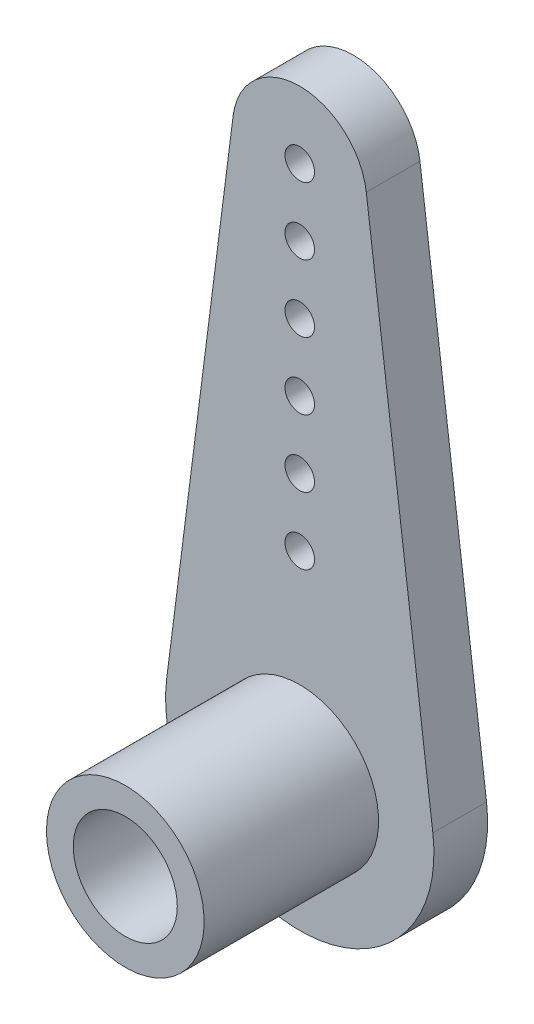
ISO-10303-21;
HEADER;
FILE_DESCRIPTION(('STEP AP214'),'2;1');
FILE_NAME('part.step','',(''),(''),'','','');
FILE_SCHEMA(('AUTOMOTIVE_DESIGN { 1 0 10303 214 1 1 1 1 }'));
ENDSEC;
DATA;
#1=APPLICATION_CONTEXT('core data for automotive mechanical design processes');
#2=APPLICATION_PROTOCOL_DEFINITION('international standard','automotive_design',2000,#1);
#3=PRODUCT_CONTEXT('',#1,'mechanical');
#4=PRODUCT('Part','Part','',(#3));
#5=PRODUCT_RELATED_PRODUCT_CATEGORY('part','',(#4));
#6=PRODUCT_DEFINITION_FORMATION('','',#4);
#7=PRODUCT_DEFINITION_CONTEXT('part definition',#1,'design');
#8=PRODUCT_DEFINITION('design','',#6,#7);
#9=PRODUCT_DEFINITION_SHAPE('','',#8);
#10=(LENGTH_UNIT() NAMED_UNIT(*) SI_UNIT(.MILLI.,.METRE.));
#11=(NAMED_UNIT(*) PLANE_ANGLE_UNIT() SI_UNIT($,.RADIAN.));
#12=(NAMED_UNIT(*) SI_UNIT($,.STERADIAN.) SOLID_ANGLE_UNIT());
#13=UNCERTAINTY_MEASURE_WITH_UNIT(LENGTH_MEASURE(1.E-05),#10,'distance_accuracy_value','');
#14=(GEOMETRIC_REPRESENTATION_CONTEXT(3) GLOBAL_UNCERTAINTY_ASSIGNED_CONTEXT((#13)) GLOBAL_UNIT_ASSIGNED_CONTEXT((#10,
#11,#12)) REPRESENTATION_CONTEXT('',''));
#15=CARTESIAN_POINT('',(0.,0.,0.));
#16=DIRECTION('',(0.,0.,1.));
#17=DIRECTION('',(1.,0.,0.));
#18=AXIS2_PLACEMENT_3D('',#15,#16,#17);
#19=CARTESIAN_POINT('',(0.,39.5,4.));
#20=DIRECTION('',(0.,0.,1.));
#21=DIRECTION('',(1.,0.,0.));
#22=AXIS2_PLACEMENT_3D('',#19,#20,#21);
#23=PLANE('',#22);
#24=CARTESIAN_POINT('',(0.,0.,4.));
#25=DIRECTION('',(0.,0.,1.));
#26=DIRECTION('',(1.,0.,0.));
#27=AXIS2_PLACEMENT_3D('',#24,#25,#26);
#28=CIRCLE('',#27,5.875);
#29=CARTESIAN_POINT('',(-5.875,0.,4.));
#30=VERTEX_POINT('',#29);
#31=EDGE_CURVE('E184',#30,#30,#28,.T.);
#32=ORIENTED_EDGE('',*,*,#31,.F.);
#33=EDGE_LOOP('',(#32));
#34=FACE_BOUND('',#33,.T.);
#35=CARTESIAN_POINT('',(2.08264233531441E-13,19.5,4.));
#36=DIRECTION('',(0.,0.,1.));
#37=DIRECTION('',(1.,0.,0.));
#38=AXIS2_PLACEMENT_3D('',#35,#36,#37);
#39=CIRCLE('',#38,1.1);
#40=CARTESIAN_POINT('',(1.10000000000021,19.5,4.));
#41=VERTEX_POINT('',#40);
#42=EDGE_CURVE('E164',#41,#41,#39,.T.);
#43=ORIENTED_EDGE('',*,*,#42,.F.);
#44=EDGE_LOOP('',(#43));
#45=FACE_BOUND('',#44,.T.);
#46=CARTESIAN_POINT('',(1.0413211676572E-13,29.5,4.));
#47=DIRECTION('',(0.,0.,1.));
#48=DIRECTION('',(1.,0.,0.));
#49=AXIS2_PLACEMENT_3D('',#46,#47,#48);
#50=CIRCLE('',#49,1.1);
#51=CARTESIAN_POINT('',(1.1000000000001,29.5,4.));
#52=VERTEX_POINT('',#51);
#53=EDGE_CURVE('E148',#52,#52,#50,.T.);
#54=ORIENTED_EDGE('',*,*,#53,.F.);
#55=EDGE_LOOP('',(#54));
#56=FACE_BOUND('',#55,.T.);
#57=CARTESIAN_POINT('',(0.,39.5,4.));
#58=DIRECTION('',(0.,0.,1.));
#59=DIRECTION('',(1.,0.,0.));
#60=AXIS2_PLACEMENT_3D('',#57,#58,#59);
#61=CIRCLE('',#60,1.1);
#62=CARTESIAN_POINT('',(1.1,39.5,4.));
#63=VERTEX_POINT('',#62);
#64=EDGE_CURVE('E118',#63,#63,#61,.T.);
#65=ORIENTED_EDGE('',*,*,#64,.F.);
#66=EDGE_LOOP('',(#65));
#67=FACE_BOUND('',#66,.T.);
#68=CARTESIAN_POINT('',(0.,39.5,4.));
#69=DIRECTION('',(0.,0.,1.));
#70=DIRECTION('',(1.,0.,0.));
#71=AXIS2_PLACEMENT_3D('',#68,#69,#70);
#72=CIRCLE('',#71,5.);
#73=CARTESIAN_POINT('',(4.95978055657343,40.1329113924051,4.));
#74=VERTEX_POINT('',#73);
#75=CARTESIAN_POINT('',(-4.95978055657343,40.1329113924051,4.));
#76=VERTEX_POINT('',#75);
#77=EDGE_CURVE('E98',#74,#76,#72,.T.);
#78=ORIENTED_EDGE('',*,*,#77,.T.);
#79=DIRECTION('',(-0.126582278481013,-0.991956111314687,0.));
#80=VECTOR('',#79,1.);
#81=CARTESIAN_POINT('',(-4.95978055657343,40.1329113924051,4.));
#82=LINE('',#81,#80);
#83=CARTESIAN_POINT('',(-9.91956111314687,1.26582278481013,4.));
#84=VERTEX_POINT('',#83);
#85=EDGE_CURVE('E93',#76,#84,#82,.T.);
#86=ORIENTED_EDGE('',*,*,#85,.T.);
#87=CARTESIAN_POINT('',(0.,0.,4.));
#88=DIRECTION('',(0.,0.,1.));
#89=DIRECTION('',(1.,0.,0.));
#90=AXIS2_PLACEMENT_3D('',#87,#88,#89);
#91=CIRCLE('',#90,10.);
#92=CARTESIAN_POINT('',(9.91956111314687,1.26582278481013,4.));
#93=VERTEX_POINT('',#92);
#94=EDGE_CURVE('E96',#84,#93,#91,.T.);
#95=ORIENTED_EDGE('',*,*,#94,.T.);
#96=DIRECTION('',(-0.126582278481013,0.991956111314687,0.));
#97=VECTOR('',#96,1.);
#98=CARTESIAN_POINT('',(4.95978055657343,40.1329113924051,4.));
#99=LINE('',#98,#97);
#100=EDGE_CURVE('E63',#93,#74,#99,.T.);
#101=ORIENTED_EDGE('',*,*,#100,.T.);
#102=EDGE_LOOP('',(#78,#86,#95,#101));
#103=FACE_BOUND('',#102,.T.);
#104=CARTESIAN_POINT('',(0.,34.5,4.));
#105=DIRECTION('',(0.,0.,1.));
#106=DIRECTION('',(1.,0.,0.));
#107=AXIS2_PLACEMENT_3D('',#104,#105,#106);
#108=CIRCLE('',#107,1.1);
#109=CARTESIAN_POINT('',(1.10000000000005,34.5,4.));
#110=VERTEX_POINT('',#109);
#111=EDGE_CURVE('E140',#110,#110,#108,.T.);
#112=ORIENTED_EDGE('',*,*,#111,.F.);
#113=EDGE_LOOP('',(#112));
#114=FACE_BOUND('',#113,.T.);
#115=CARTESIAN_POINT('',(1.56198175148581E-13,24.5,4.));
#116=DIRECTION('',(0.,0.,1.));
#117=DIRECTION('',(1.,0.,0.));
#118=AXIS2_PLACEMENT_3D('',#115,#116,#117);
#119=CIRCLE('',#118,1.1);
#120=CARTESIAN_POINT('',(1.10000000000016,24.5,4.));
#121=VERTEX_POINT('',#120);
#122=EDGE_CURVE('E156',#121,#121,#119,.T.);
#123=ORIENTED_EDGE('',*,*,#122,.F.);
#124=EDGE_LOOP('',(#123));
#125=FACE_BOUND('',#124,.T.);
#126=CARTESIAN_POINT('',(2.60330291914301E-13,14.5,4.));
#127=DIRECTION('',(0.,0.,1.));
#128=DIRECTION('',(1.,0.,0.));
#129=AXIS2_PLACEMENT_3D('',#126,#127,#128);
#130=CIRCLE('',#129,1.1);
#131=CARTESIAN_POINT('',(1.10000000000026,14.5,4.));
#132=VERTEX_POINT('',#131);
#133=EDGE_CURVE('E172',#132,#132,#130,.T.);
#134=ORIENTED_EDGE('',*,*,#133,.F.);
#135=EDGE_LOOP('',(#134));
#136=FACE_BOUND('',#135,.T.);
#137=ADVANCED_FACE('F45',(#34,#45,#56,#67,#103,#114,#125,#136),#23,.T.);
#138=CARTESIAN_POINT('',(0.,39.5,0.));
#139=DIRECTION('',(0.,0.,1.));
#140=DIRECTION('',(1.,0.,0.));
#141=AXIS2_PLACEMENT_3D('',#138,#139,#140);
#142=PLANE('',#141);
#143=CARTESIAN_POINT('',(0.,0.,0.));
#144=DIRECTION('',(0.,0.,1.));
#145=DIRECTION('',(1.,0.,0.));
#146=AXIS2_PLACEMENT_3D('',#143,#144,#145);
#147=CIRCLE('',#146,3.875);
#148=CARTESIAN_POINT('',(3.875,0.,0.));
#149=VERTEX_POINT('',#148);
#150=EDGE_CURVE('E188',#149,#149,#147,.F.);
#151=ORIENTED_EDGE('',*,*,#150,.F.);
#152=EDGE_LOOP('',(#151));
#153=FACE_BOUND('',#152,.T.);
#154=CARTESIAN_POINT('',(0.,39.5,0.));
#155=DIRECTION('',(0.,0.,1.));
#156=DIRECTION('',(1.,0.,0.));
#157=AXIS2_PLACEMENT_3D('',#154,#155,#156);
#158=CIRCLE('',#157,5.);
#159=CARTESIAN_POINT('',(4.95978055657343,40.1329113924051,0.));
#160=VERTEX_POINT('',#159);
#161=CARTESIAN_POINT('',(-4.95978055657343,40.1329113924051,0.));
#162=VERTEX_POINT('',#161);
#163=EDGE_CURVE('E114',#160,#162,#158,.T.);
#164=ORIENTED_EDGE('',*,*,#163,.F.);
#165=DIRECTION('',(-0.126582278481013,0.991956111314687,0.));
#166=VECTOR('',#165,1.);
#167=CARTESIAN_POINT('',(4.95978055657343,40.1329113924051,0.));
#168=LINE('',#167,#166);
#169=CARTESIAN_POINT('',(9.91956111314687,1.26582278481013,0.));
#170=VERTEX_POINT('',#169);
#171=EDGE_CURVE('E86',#170,#160,#168,.T.);
#172=ORIENTED_EDGE('',*,*,#171,.F.);
#173=CARTESIAN_POINT('',(0.,0.,0.));
#174=DIRECTION('',(0.,0.,1.));
#175=DIRECTION('',(1.,0.,0.));
#176=AXIS2_PLACEMENT_3D('',#173,#174,#175);
#177=CIRCLE('',#176,10.);
#178=CARTESIAN_POINT('',(-9.91956111314687,1.26582278481013,0.));
#179=VERTEX_POINT('',#178);
#180=EDGE_CURVE('E80',#179,#170,#177,.T.);
#181=ORIENTED_EDGE('',*,*,#180,.F.);
#182=DIRECTION('',(-0.126582278481013,-0.991956111314687,0.));
#183=VECTOR('',#182,1.);
#184=CARTESIAN_POINT('',(-4.95978055657343,40.1329113924051,0.));
#185=LINE('',#184,#183);
#186=EDGE_CURVE('E103',#162,#179,#185,.T.);
#187=ORIENTED_EDGE('',*,*,#186,.F.);
#188=EDGE_LOOP('',(#164,#172,#181,#187));
#189=FACE_BOUND('',#188,.T.);
#190=CARTESIAN_POINT('',(0.,39.5,0.));
#191=DIRECTION('',(0.,0.,1.));
#192=DIRECTION('',(1.,0.,0.));
#193=AXIS2_PLACEMENT_3D('',#190,#191,#192);
#194=CIRCLE('',#193,1.1);
#195=CARTESIAN_POINT('',(1.1,39.5,0.));
#196=VERTEX_POINT('',#195);
#197=EDGE_CURVE('E136',#196,#196,#194,.T.);
#198=ORIENTED_EDGE('',*,*,#197,.T.);
#199=EDGE_LOOP('',(#198));
#200=FACE_BOUND('',#199,.T.);
#201=CARTESIAN_POINT('',(0.,34.5,0.));
#202=DIRECTION('',(0.,0.,1.));
#203=DIRECTION('',(1.,0.,0.));
#204=AXIS2_PLACEMENT_3D('',#201,#202,#203);
#205=CIRCLE('',#204,1.1);
#206=CARTESIAN_POINT('',(1.10000000000005,34.5,0.));
#207=VERTEX_POINT('',#206);
#208=EDGE_CURVE('E144',#207,#207,#205,.T.);
#209=ORIENTED_EDGE('',*,*,#208,.T.);
#210=EDGE_LOOP('',(#209));
#211=FACE_BOUND('',#210,.T.);
#212=CARTESIAN_POINT('',(1.0413211676572E-13,29.5,0.));
#213=DIRECTION('',(0.,0.,1.));
#214=DIRECTION('',(1.,0.,0.));
#215=AXIS2_PLACEMENT_3D('',#212,#213,#214);
#216=CIRCLE('',#215,1.1);
#217=CARTESIAN_POINT('',(1.1000000000001,29.5,0.));
#218=VERTEX_POINT('',#217);
#219=EDGE_CURVE('E152',#218,#218,#216,.T.);
#220=ORIENTED_EDGE('',*,*,#219,.T.);
#221=EDGE_LOOP('',(#220));
#222=FACE_BOUND('',#221,.T.);
#223=CARTESIAN_POINT('',(1.56198175148581E-13,24.5,0.));
#224=DIRECTION('',(0.,0.,1.));
#225=DIRECTION('',(1.,0.,0.));
#226=AXIS2_PLACEMENT_3D('',#223,#224,#225);
#227=CIRCLE('',#226,1.1);
#228=CARTESIAN_POINT('',(1.10000000000016,24.5,0.));
#229=VERTEX_POINT('',#228);
#230=EDGE_CURVE('E160',#229,#229,#227,.T.);
#231=ORIENTED_EDGE('',*,*,#230,.T.);
#232=EDGE_LOOP('',(#231));
#233=FACE_BOUND('',#232,.T.);
#234=CARTESIAN_POINT('',(2.08264233531441E-13,19.5,0.));
#235=DIRECTION('',(0.,0.,1.));
#236=DIRECTION('',(1.,0.,0.));
#237=AXIS2_PLACEMENT_3D('',#234,#235,#236);
#238=CIRCLE('',#237,1.1);
#239=CARTESIAN_POINT('',(1.10000000000021,19.5,0.));
#240=VERTEX_POINT('',#239);
#241=EDGE_CURVE('E168',#240,#240,#238,.T.);
#242=ORIENTED_EDGE('',*,*,#241,.T.);
#243=EDGE_LOOP('',(#242));
#244=FACE_BOUND('',#243,.T.);
#245=CARTESIAN_POINT('',(2.60330291914301E-13,14.5,0.));
#246=DIRECTION('',(0.,0.,1.));
#247=DIRECTION('',(1.,0.,0.));
#248=AXIS2_PLACEMENT_3D('',#245,#246,#247);
#249=CIRCLE('',#248,1.1);
#250=CARTESIAN_POINT('',(1.10000000000026,14.5,0.));
#251=VERTEX_POINT('',#250);
#252=EDGE_CURVE('E176',#251,#251,#249,.T.);
#253=ORIENTED_EDGE('',*,*,#252,.T.);
#254=EDGE_LOOP('',(#253));
#255=FACE_BOUND('',#254,.T.);
#256=ADVANCED_FACE('F131',(#153,#189,#200,#211,#222,#233,#244,#255),#142,.F.);
#257=CARTESIAN_POINT('',(0.,39.5,4.));
#258=DIRECTION('',(0.,0.,-1.));
#259=DIRECTION('',(-1.,0.,0.));
#260=AXIS2_PLACEMENT_3D('',#257,#258,#259);
#261=CYLINDRICAL_SURFACE('',#260,5.);
#262=ORIENTED_EDGE('',*,*,#163,.T.);
#263=DIRECTION('',(0.,0.,-1.));
#264=VECTOR('',#263,1.);
#265=CARTESIAN_POINT('',(-4.95978055657343,40.1329113924051,4.));
#266=LINE('',#265,#264);
#267=EDGE_CURVE('E11',#76,#162,#266,.T.);
#268=ORIENTED_EDGE('',*,*,#267,.F.);
#269=ORIENTED_EDGE('',*,*,#77,.F.);
#270=DIRECTION('',(0.,0.,-1.));
#271=VECTOR('',#270,1.);
#272=CARTESIAN_POINT('',(4.95978055657343,40.1329113924051,4.));
#273=LINE('',#272,#271);
#274=EDGE_CURVE('E110',#74,#160,#273,.T.);
#275=ORIENTED_EDGE('',*,*,#274,.T.);
#276=EDGE_LOOP('',(#262,#268,#269,#275));
#277=FACE_BOUND('',#276,.T.);
#278=ADVANCED_FACE('F47',(#277),#261,.T.);
#279=CARTESIAN_POINT('',(-4.95978055657343,40.1329113924051,4.));
#280=DIRECTION('',(0.991956111314687,-0.126582278481013,0.));
#281=DIRECTION('',(0.126582278481013,0.991956111314687,0.));
#282=AXIS2_PLACEMENT_3D('',#279,#280,#281);
#283=PLANE('',#282);
#284=ORIENTED_EDGE('',*,*,#186,.T.);
#285=DIRECTION('',(0.,0.,-1.));
#286=VECTOR('',#285,1.);
#287=CARTESIAN_POINT('',(-9.91956111314687,1.26582278481013,4.));
#288=LINE('',#287,#286);
#289=EDGE_CURVE('E55',#84,#179,#288,.T.);
#290=ORIENTED_EDGE('',*,*,#289,.F.);
#291=ORIENTED_EDGE('',*,*,#85,.F.);
#292=ORIENTED_EDGE('',*,*,#267,.T.);
#293=EDGE_LOOP('',(#284,#290,#291,#292));
#294=FACE_BOUND('',#293,.T.);
#295=ADVANCED_FACE('F102',(#294),#283,.F.);
#296=CARTESIAN_POINT('',(0.,0.,4.));
#297=DIRECTION('',(0.,0.,-1.));
#298=DIRECTION('',(-1.,0.,0.));
#299=AXIS2_PLACEMENT_3D('',#296,#297,#298);
#300=CYLINDRICAL_SURFACE('',#299,10.);
#301=ORIENTED_EDGE('',*,*,#180,.T.);
#302=DIRECTION('',(0.,0.,-1.));
#303=VECTOR('',#302,1.);
#304=CARTESIAN_POINT('',(9.91956111314687,1.26582278481013,4.));
#305=LINE('',#304,#303);
#306=EDGE_CURVE('E105',#93,#170,#305,.T.);
#307=ORIENTED_EDGE('',*,*,#306,.F.);
#308=ORIENTED_EDGE('',*,*,#94,.F.);
#309=ORIENTED_EDGE('',*,*,#289,.T.);
#310=EDGE_LOOP('',(#301,#307,#308,#309));
#311=FACE_BOUND('',#310,.T.);
#312=ADVANCED_FACE('F106',(#311),#300,.T.);
#313=CARTESIAN_POINT('',(4.95978055657343,40.1329113924051,4.));
#314=DIRECTION('',(-0.991956111314687,-0.126582278481013,0.));
#315=DIRECTION('',(0.126582278481013,-0.991956111314687,0.));
#316=AXIS2_PLACEMENT_3D('',#313,#314,#315);
#317=PLANE('',#316);
#318=ORIENTED_EDGE('',*,*,#171,.T.);
#319=ORIENTED_EDGE('',*,*,#274,.F.);
#320=ORIENTED_EDGE('',*,*,#100,.F.);
#321=ORIENTED_EDGE('',*,*,#306,.T.);
#322=EDGE_LOOP('',(#318,#319,#320,#321));
#323=FACE_BOUND('',#322,.T.);
#324=ADVANCED_FACE('F128',(#323),#317,.F.);
#325=CARTESIAN_POINT('',(0.,39.5,4.));
#326=DIRECTION('',(0.,0.,-1.));
#327=DIRECTION('',(-1.,0.,0.));
#328=AXIS2_PLACEMENT_3D('',#325,#326,#327);
#329=CYLINDRICAL_SURFACE('',#328,1.1);
#330=ORIENTED_EDGE('',*,*,#64,.T.);
#331=EDGE_LOOP('',(#330));
#332=FACE_BOUND('',#331,.T.);
#333=ORIENTED_EDGE('',*,*,#197,.F.);
#334=EDGE_LOOP('',(#333));
#335=FACE_BOUND('',#334,.T.);
#336=ADVANCED_FACE('F225',(#332,#335),#329,.F.);
#337=CARTESIAN_POINT('',(0.,34.5,4.));
#338=DIRECTION('',(0.,0.,-1.));
#339=DIRECTION('',(-1.,0.,0.));
#340=AXIS2_PLACEMENT_3D('',#337,#338,#339);
#341=CYLINDRICAL_SURFACE('',#340,1.1);
#342=ORIENTED_EDGE('',*,*,#111,.T.);
#343=EDGE_LOOP('',(#342));
#344=FACE_BOUND('',#343,.T.);
#345=ORIENTED_EDGE('',*,*,#208,.F.);
#346=EDGE_LOOP('',(#345));
#347=FACE_BOUND('',#346,.T.);
#348=ADVANCED_FACE('F228',(#344,#347),#341,.F.);
#349=CARTESIAN_POINT('',(1.0413211676572E-13,29.5,4.));
#350=DIRECTION('',(0.,0.,-1.));
#351=DIRECTION('',(-1.,0.,0.));
#352=AXIS2_PLACEMENT_3D('',#349,#350,#351);
#353=CYLINDRICAL_SURFACE('',#352,1.1);
#354=ORIENTED_EDGE('',*,*,#53,.T.);
#355=EDGE_LOOP('',(#354));
#356=FACE_BOUND('',#355,.T.);
#357=ORIENTED_EDGE('',*,*,#219,.F.);
#358=EDGE_LOOP('',(#357));
#359=FACE_BOUND('',#358,.T.);
#360=ADVANCED_FACE('F258',(#356,#359),#353,.F.);
#361=CARTESIAN_POINT('',(1.56198175148581E-13,24.5,4.));
#362=DIRECTION('',(0.,0.,-1.));
#363=DIRECTION('',(-1.,0.,0.));
#364=AXIS2_PLACEMENT_3D('',#361,#362,#363);
#365=CYLINDRICAL_SURFACE('',#364,1.1);
#366=ORIENTED_EDGE('',*,*,#122,.T.);
#367=EDGE_LOOP('',(#366));
#368=FACE_BOUND('',#367,.T.);
#369=ORIENTED_EDGE('',*,*,#230,.F.);
#370=EDGE_LOOP('',(#369));
#371=FACE_BOUND('',#370,.T.);
#372=ADVANCED_FACE('F252',(#368,#371),#365,.F.);
#373=CARTESIAN_POINT('',(2.08264233531441E-13,19.5,4.));
#374=DIRECTION('',(0.,0.,-1.));
#375=DIRECTION('',(-1.,0.,0.));
#376=AXIS2_PLACEMENT_3D('',#373,#374,#375);
#377=CYLINDRICAL_SURFACE('',#376,1.1);
#378=ORIENTED_EDGE('',*,*,#42,.T.);
#379=EDGE_LOOP('',(#378));
#380=FACE_BOUND('',#379,.T.);
#381=ORIENTED_EDGE('',*,*,#241,.F.);
#382=EDGE_LOOP('',(#381));
#383=FACE_BOUND('',#382,.T.);
#384=ADVANCED_FACE('F246',(#380,#383),#377,.F.);
#385=CARTESIAN_POINT('',(2.60330291914301E-13,14.5,4.));
#386=DIRECTION('',(0.,0.,-1.));
#387=DIRECTION('',(-1.,0.,0.));
#388=AXIS2_PLACEMENT_3D('',#385,#386,#387);
#389=CYLINDRICAL_SURFACE('',#388,1.1);
#390=ORIENTED_EDGE('',*,*,#133,.T.);
#391=EDGE_LOOP('',(#390));
#392=FACE_BOUND('',#391,.T.);
#393=ORIENTED_EDGE('',*,*,#252,.F.);
#394=EDGE_LOOP('',(#393));
#395=FACE_BOUND('',#394,.T.);
#396=ADVANCED_FACE('F212',(#392,#395),#389,.F.);
#397=CARTESIAN_POINT('',(0.,0.,17.));
#398=DIRECTION('',(0.,0.,-1.));
#399=DIRECTION('',(-1.,0.,0.));
#400=AXIS2_PLACEMENT_3D('',#397,#398,#399);
#401=CYLINDRICAL_SURFACE('',#400,5.875);
#402=CARTESIAN_POINT('',(0.,0.,17.));
#403=DIRECTION('',(0.,0.,1.));
#404=DIRECTION('',(1.,0.,0.));
#405=AXIS2_PLACEMENT_3D('',#402,#403,#404);
#406=CIRCLE('',#405,5.875);
#407=CARTESIAN_POINT('',(-5.875,0.,17.));
#408=VERTEX_POINT('',#407);
#409=EDGE_CURVE('E180',#408,#408,#406,.T.);
#410=CARTESIAN_POINT('',(-5.875,0.,17.));
#411=CARTESIAN_POINT('',(-5.875,0.,16.8645833333333));
#412=CARTESIAN_POINT('',(-5.875,0.,16.7291666666667));
#413=CARTESIAN_POINT('',(-5.875,0.,16.4583333333333));
#414=CARTESIAN_POINT('',(-5.875,0.,16.3229166666667));
#415=CARTESIAN_POINT('',(-5.875,0.,16.0520833333333));
#416=CARTESIAN_POINT('',(-5.875,0.,15.9166666666667));
#417=CARTESIAN_POINT('',(-5.875,0.,15.6458333333333));
#418=CARTESIAN_POINT('',(-5.875,0.,15.5104166666667));
#419=CARTESIAN_POINT('',(-5.875,0.,15.2395833333333));
#420=CARTESIAN_POINT('',(-5.875,0.,15.1041666666667));
#421=CARTESIAN_POINT('',(-5.875,0.,14.8333333333333));
#422=CARTESIAN_POINT('',(-5.875,0.,14.6979166666667));
#423=CARTESIAN_POINT('',(-5.875,0.,14.4270833333333));
#424=CARTESIAN_POINT('',(-5.875,0.,14.2916666666667));
#425=CARTESIAN_POINT('',(-5.875,0.,14.0208333333333));
#426=CARTESIAN_POINT('',(-5.875,0.,13.8854166666667));
#427=CARTESIAN_POINT('',(-5.875,0.,13.6145833333333));
#428=CARTESIAN_POINT('',(-5.875,0.,13.4791666666667));
#429=CARTESIAN_POINT('',(-5.875,0.,13.2083333333333));
#430=CARTESIAN_POINT('',(-5.875,0.,13.0729166666667));
#431=CARTESIAN_POINT('',(-5.875,0.,12.8020833333333));
#432=CARTESIAN_POINT('',(-5.875,0.,12.6666666666667));
#433=CARTESIAN_POINT('',(-5.875,0.,12.3958333333333));
#434=CARTESIAN_POINT('',(-5.875,0.,12.2604166666667));
#435=CARTESIAN_POINT('',(-5.875,0.,11.9895833333333));
#436=CARTESIAN_POINT('',(-5.875,0.,11.8541666666667));
#437=CARTESIAN_POINT('',(-5.875,0.,11.5833333333333));
#438=CARTESIAN_POINT('',(-5.875,0.,11.4479166666667));
#439=CARTESIAN_POINT('',(-5.875,0.,11.1770833333333));
#440=CARTESIAN_POINT('',(-5.875,0.,11.0416666666667));
#441=CARTESIAN_POINT('',(-5.875,0.,10.7708333333333));
#442=CARTESIAN_POINT('',(-5.875,0.,10.6354166666667));
#443=CARTESIAN_POINT('',(-5.875,0.,10.3645833333333));
#444=CARTESIAN_POINT('',(-5.875,0.,10.2291666666667));
#445=CARTESIAN_POINT('',(-5.875,0.,9.95833333333333));
#446=CARTESIAN_POINT('',(-5.875,0.,9.82291666666667));
#447=CARTESIAN_POINT('',(-5.875,0.,9.55208333333333));
#448=CARTESIAN_POINT('',(-5.875,0.,9.41666666666667));
#449=CARTESIAN_POINT('',(-5.875,0.,9.14583333333333));
#450=CARTESIAN_POINT('',(-5.875,0.,9.01041666666666));
#451=CARTESIAN_POINT('',(-5.875,0.,8.73958333333333));
#452=CARTESIAN_POINT('',(-5.875,0.,8.60416666666667));
#453=CARTESIAN_POINT('',(-5.875,0.,8.33333333333333));
#454=CARTESIAN_POINT('',(-5.875,0.,8.19791666666667));
#455=CARTESIAN_POINT('',(-5.875,0.,7.92708333333333));
#456=CARTESIAN_POINT('',(-5.875,0.,7.79166666666667));
#457=CARTESIAN_POINT('',(-5.875,0.,7.52083333333333));
#458=CARTESIAN_POINT('',(-5.875,0.,7.38541666666667));
#459=CARTESIAN_POINT('',(-5.875,0.,7.11458333333333));
#460=CARTESIAN_POINT('',(-5.875,0.,6.97916666666667));
#461=CARTESIAN_POINT('',(-5.875,0.,6.70833333333333));
#462=CARTESIAN_POINT('',(-5.875,0.,6.57291666666667));
#463=CARTESIAN_POINT('',(-5.875,0.,6.30208333333333));
#464=CARTESIAN_POINT('',(-5.875,0.,6.16666666666667));
#465=CARTESIAN_POINT('',(-5.875,0.,5.89583333333333));
#466=CARTESIAN_POINT('',(-5.875,0.,5.76041666666666));
#467=CARTESIAN_POINT('',(-5.875,0.,5.48958333333333));
#468=CARTESIAN_POINT('',(-5.875,0.,5.35416666666667));
#469=CARTESIAN_POINT('',(-5.875,0.,5.08333333333333));
#470=CARTESIAN_POINT('',(-5.875,0.,4.94791666666667));
#471=CARTESIAN_POINT('',(-5.875,0.,4.67708333333333));
#472=CARTESIAN_POINT('',(-5.875,0.,4.54166666666667));
#473=CARTESIAN_POINT('',(-5.875,0.,4.27083333333333));
#474=CARTESIAN_POINT('',(-5.875,0.,4.13541666666667));
#475=CARTESIAN_POINT('',(-5.875,0.,4.));
#476=B_SPLINE_CURVE_WITH_KNOTS('',3,(#410,#411,#412,#413,#414,#415,#416,#417,#418,#419,#420,
#421,#422,#423,#424,#425,#426,#427,#428,#429,#430,#431,#432,#433,#434,#435,#436,#437,#438,#439,
#440,#441,#442,#443,#444,#445,#446,#447,#448,#449,#450,#451,#452,#453,#454,#455,#456,#457,#458,
#459,#460,#461,#462,#463,#464,#465,#466,#467,#468,#469,#470,#471,#472,#473,#474,#475),
.UNSPECIFIED.,.F.,.F.,(4,2,2,2,2,2,2,2,2,2,2,2,2,2,2,2,2,2,2,2,2,2,2,2,2,2,2,2,2,2,2,2,4),(0.,
0.40625,0.812500000000001,1.21875,1.625,2.03125,2.4375,2.84375,3.25,3.65625,4.0625,4.46875,
4.875,5.28125,5.6875,6.09375,6.5,6.90625,7.3125,7.71875,8.125,8.53125,8.9375,9.34375,9.75,
10.15625,10.5625,10.96875,11.375,11.78125,12.1875,12.59375,13.),.UNSPECIFIED.);
#477=EDGE_CURVE('BSEAM206',#408,#30,#476,.T.);
#478=ORIENTED_EDGE('',*,*,#409,.F.);
#479=ORIENTED_EDGE('',*,*,#31,.T.);
#480=ORIENTED_EDGE('',*,*,#477,.T.);
#481=ORIENTED_EDGE('',*,*,#477,.F.);
#482=EDGE_LOOP('',(#478,#480,#479,#481));
#483=FACE_BOUND('',#482,.T.);
#484=ADVANCED_FACE('F206',(#483),#401,.T.);
#485=CARTESIAN_POINT('',(0.,0.,17.));
#486=DIRECTION('',(0.,0.,1.));
#487=DIRECTION('',(1.,0.,0.));
#488=AXIS2_PLACEMENT_3D('',#485,#486,#487);
#489=PLANE('',#488);
#490=CARTESIAN_POINT('',(0.,0.,17.));
#491=DIRECTION('',(0.,0.,1.));
#492=DIRECTION('',(1.,0.,0.));
#493=AXIS2_PLACEMENT_3D('',#490,#491,#492);
#494=CIRCLE('',#493,3.875);
#495=CARTESIAN_POINT('',(3.875,0.,17.));
#496=VERTEX_POINT('',#495);
#497=EDGE_CURVE('E195',#496,#496,#494,.T.);
#498=ORIENTED_EDGE('',*,*,#497,.F.);
#499=EDGE_LOOP('',(#498));
#500=FACE_BOUND('',#499,.T.);
#501=ORIENTED_EDGE('',*,*,#409,.T.);
#502=EDGE_LOOP('',(#501));
#503=FACE_BOUND('',#502,.T.);
#504=ADVANCED_FACE('F203',(#500,#503),#489,.T.);
#505=CARTESIAN_POINT('',(0.,0.,17.));
#506=DIRECTION('',(0.,0.,-1.));
#507=DIRECTION('',(-1.,0.,0.));
#508=AXIS2_PLACEMENT_3D('',#505,#506,#507);
#509=CYLINDRICAL_SURFACE('',#508,3.875);
#510=ORIENTED_EDGE('',*,*,#497,.T.);
#511=EDGE_LOOP('',(#510));
#512=FACE_BOUND('',#511,.T.);
#513=ORIENTED_EDGE('',*,*,#150,.T.);
#514=EDGE_LOOP('',(#513));
#515=FACE_BOUND('',#514,.T.);
#516=ADVANCED_FACE('F200',(#512,#515),#509,.F.);
#517=CLOSED_SHELL('',(#137,#256,#278,#295,#312,#324,#336,#348,#360,#372,#384,#396,#484,#504,#516));
#518=MANIFOLD_SOLID_BREP('B2',#517);
#519=ADVANCED_BREP_SHAPE_REPRESENTATION('',(#18,#518),#14);
#520=SHAPE_DEFINITION_REPRESENTATION(#9,#519);
ENDSEC;
END-ISO-10303-21;
